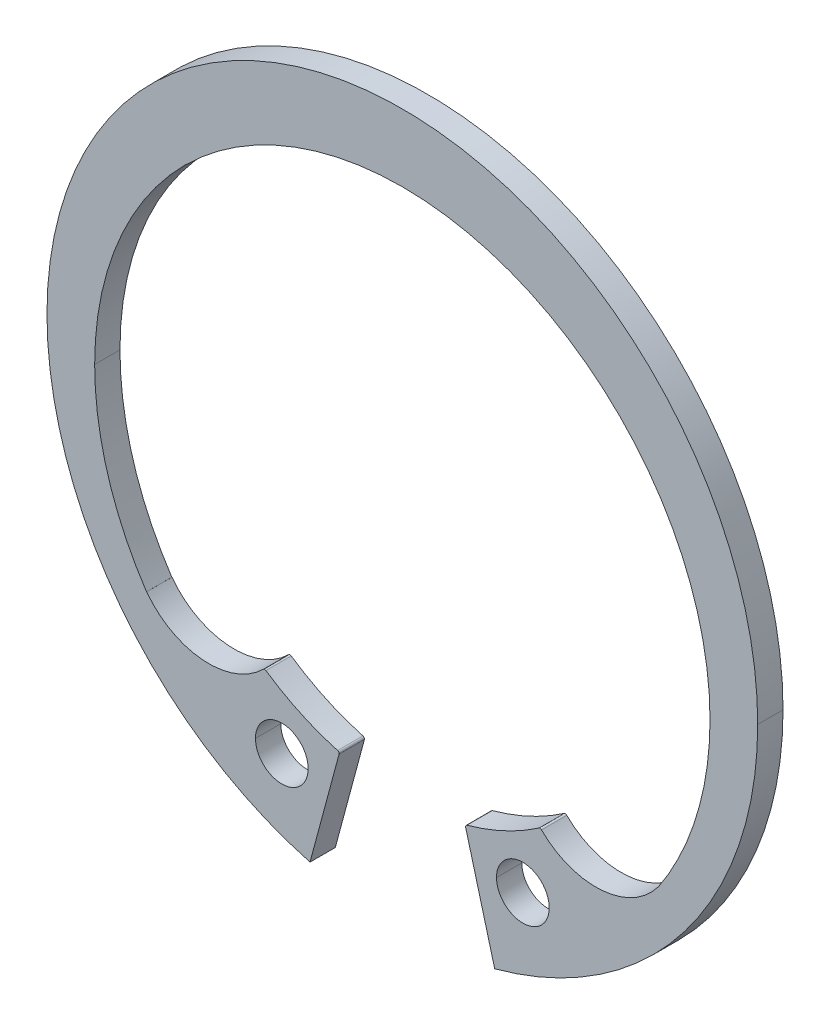
ISO-10303-21;
HEADER;
FILE_DESCRIPTION(('STEP AP214'),'2;1');
FILE_NAME('part.step','',(''),(''),'','','');
FILE_SCHEMA(('AUTOMOTIVE_DESIGN { 1 0 10303 214 1 1 1 1 }'));
ENDSEC;
DATA;
#1=APPLICATION_CONTEXT('core data for automotive mechanical design processes');
#2=APPLICATION_PROTOCOL_DEFINITION('international standard','automotive_design',2000,#1);
#3=PRODUCT_CONTEXT('',#1,'mechanical');
#4=PRODUCT('Part','Part','',(#3));
#5=PRODUCT_RELATED_PRODUCT_CATEGORY('part','',(#4));
#6=PRODUCT_DEFINITION_FORMATION('','',#4);
#7=PRODUCT_DEFINITION_CONTEXT('part definition',#1,'design');
#8=PRODUCT_DEFINITION('design','',#6,#7);
#9=PRODUCT_DEFINITION_SHAPE('','',#8);
#10=(LENGTH_UNIT() NAMED_UNIT(*) SI_UNIT(.MILLI.,.METRE.));
#11=(NAMED_UNIT(*) PLANE_ANGLE_UNIT() SI_UNIT($,.RADIAN.));
#12=(NAMED_UNIT(*) SI_UNIT($,.STERADIAN.) SOLID_ANGLE_UNIT());
#13=UNCERTAINTY_MEASURE_WITH_UNIT(LENGTH_MEASURE(1.E-05),#10,'distance_accuracy_value','');
#14=(GEOMETRIC_REPRESENTATION_CONTEXT(3) GLOBAL_UNCERTAINTY_ASSIGNED_CONTEXT((#13)) GLOBAL_UNIT_ASSIGNED_CONTEXT((#10,
#11,#12)) REPRESENTATION_CONTEXT('',''));
#15=CARTESIAN_POINT('',(0.,0.,0.));
#16=DIRECTION('',(0.,0.,1.));
#17=DIRECTION('',(1.,0.,0.));
#18=AXIS2_PLACEMENT_3D('',#15,#16,#17);
#19=CARTESIAN_POINT('',(-3.09794375698009,-11.1267805082417,-1.2));
#20=DIRECTION('',(0.,0.,1.));
#21=DIRECTION('',(1.,0.,0.));
#22=AXIS2_PLACEMENT_3D('',#19,#20,#21);
#23=CYLINDRICAL_SURFACE('',#22,0.100000000000002);
#24=DIRECTION('',(0.,0.,1.));
#25=VECTOR('',#24,1.);
#26=CARTESIAN_POINT('',(-2.99794375698009,-11.1267805082417,-1.2));
#27=LINE('',#26,#25);
#28=CARTESIAN_POINT('',(-2.99794375698009,-11.1267805082417,-1.2));
#29=VERTEX_POINT('',#28);
#30=CARTESIAN_POINT('',(-2.99794375698009,-11.1267805082417,0.));
#31=VERTEX_POINT('',#30);
#32=EDGE_CURVE('E288',#29,#31,#27,.T.);
#33=ORIENTED_EDGE('',*,*,#32,.F.);
#34=CARTESIAN_POINT('',(-3.09794375698009,-11.1267805082417,-1.2));
#35=DIRECTION('',(0.,0.,1.));
#36=DIRECTION('',(-1.,0.,0.));
#37=AXIS2_PLACEMENT_3D('',#34,#35,#36);
#38=CIRCLE('',#37,0.100000000000002);
#39=CARTESIAN_POINT('',(-3.07112173311014,-11.0304447462656,-1.2));
#40=VERTEX_POINT('',#39);
#41=EDGE_CURVE('E254',#29,#40,#38,.T.);
#42=ORIENTED_EDGE('',*,*,#41,.T.);
#43=DIRECTION('',(0.,0.,1.));
#44=VECTOR('',#43,1.);
#45=CARTESIAN_POINT('',(-3.07112173311014,-11.0304447462656,-1.2));
#46=LINE('',#45,#44);
#47=CARTESIAN_POINT('',(-3.07112173311014,-11.0304447462656,0.));
#48=VERTEX_POINT('',#47);
#49=EDGE_CURVE('E267',#40,#48,#46,.T.);
#50=ORIENTED_EDGE('',*,*,#49,.T.);
#51=CARTESIAN_POINT('',(-3.09794375698009,-11.1267805082417,0.));
#52=DIRECTION('',(0.,0.,1.));
#53=DIRECTION('',(-1.,0.,0.));
#54=AXIS2_PLACEMENT_3D('',#51,#52,#53);
#55=CIRCLE('',#54,0.100000000000002);
#56=EDGE_CURVE('E259',#31,#48,#55,.T.);
#57=ORIENTED_EDGE('',*,*,#56,.F.);
#58=EDGE_LOOP('',(#33,#42,#50,#57));
#59=FACE_BOUND('',#58,.T.);
#60=ADVANCED_FACE('F17',(#59),#23,.T.);
#61=CARTESIAN_POINT('',(-6.52530150985386,-9.53010704061077,-1.2));
#62=DIRECTION('',(0.,0.,1.));
#63=DIRECTION('',(1.,0.,0.));
#64=AXIS2_PLACEMENT_3D('',#61,#62,#63);
#65=CYLINDRICAL_SURFACE('',#64,0.100000000000005);
#66=CARTESIAN_POINT('',(-6.52530150985386,-9.53010704061077,0.));
#67=DIRECTION('',(0.,0.,1.));
#68=DIRECTION('',(1.,0.,0.));
#69=AXIS2_PLACEMENT_3D('',#66,#67,#68);
#70=CIRCLE('',#69,0.100000000000005);
#71=CARTESIAN_POINT('',(-6.46880539288542,-9.44759529134141,0.));
#72=VERTEX_POINT('',#71);
#73=CARTESIAN_POINT('',(-6.59559305403814,-9.45897969835626,0.));
#74=VERTEX_POINT('',#73);
#75=EDGE_CURVE('E342',#72,#74,#70,.T.);
#76=ORIENTED_EDGE('',*,*,#75,.F.);
#77=DIRECTION('',(0.,0.,1.));
#78=VECTOR('',#77,1.);
#79=CARTESIAN_POINT('',(-6.46880539288542,-9.44759529134141,-1.2));
#80=LINE('',#79,#78);
#81=CARTESIAN_POINT('',(-6.46880539288542,-9.44759529134141,-1.2));
#82=VERTEX_POINT('',#81);
#83=EDGE_CURVE('E318',#82,#72,#80,.T.);
#84=ORIENTED_EDGE('',*,*,#83,.F.);
#85=CARTESIAN_POINT('',(-6.52530150985386,-9.53010704061077,-1.2));
#86=DIRECTION('',(0.,0.,1.));
#87=DIRECTION('',(1.,0.,0.));
#88=AXIS2_PLACEMENT_3D('',#85,#86,#87);
#89=CIRCLE('',#88,0.100000000000005);
#90=CARTESIAN_POINT('',(-6.59559305403814,-9.45897969835626,-1.2));
#91=VERTEX_POINT('',#90);
#92=EDGE_CURVE('E366',#82,#91,#89,.T.);
#93=ORIENTED_EDGE('',*,*,#92,.T.);
#94=DIRECTION('',(0.,0.,1.));
#95=VECTOR('',#94,1.);
#96=CARTESIAN_POINT('',(-6.59559305403814,-9.45897969835626,-1.2));
#97=LINE('',#96,#95);
#98=EDGE_CURVE('E11',#91,#74,#97,.T.);
#99=ORIENTED_EDGE('',*,*,#98,.T.);
#100=EDGE_LOOP('',(#76,#84,#93,#99));
#101=FACE_BOUND('',#100,.T.);
#102=ADVANCED_FACE('F569',(#101),#65,.T.);
#103=CARTESIAN_POINT('',(-9.1782052770994,-6.84565905457062,-1.2));
#104=DIRECTION('',(0.,0.,1.));
#105=DIRECTION('',(1.,0.,0.));
#106=AXIS2_PLACEMENT_3D('',#103,#104,#105);
#107=CYLINDRICAL_SURFACE('',#106,3.67414353039474);
#108=CARTESIAN_POINT('',(-9.1782052770994,-6.84565905457062,0.));
#109=DIRECTION('',(0.,0.,-1.));
#110=DIRECTION('',(1.,0.,0.));
#111=AXIS2_PLACEMENT_3D('',#108,#109,#110);
#112=CIRCLE('',#111,3.67414353039474);
#113=CARTESIAN_POINT('',(-12.1233619181029,-9.04233450667882,0.));
#114=VERTEX_POINT('',#113);
#115=EDGE_CURVE('E331',#74,#114,#112,.T.);
#116=ORIENTED_EDGE('',*,*,#115,.F.);
#117=ORIENTED_EDGE('',*,*,#98,.F.);
#118=CARTESIAN_POINT('',(-9.1782052770994,-6.84565905457062,-1.2));
#119=DIRECTION('',(0.,0.,-1.));
#120=DIRECTION('',(1.,0.,0.));
#121=AXIS2_PLACEMENT_3D('',#118,#119,#120);
#122=CIRCLE('',#121,3.67414353039474);
#123=CARTESIAN_POINT('',(-12.1233619181029,-9.04233450667882,-1.2));
#124=VERTEX_POINT('',#123);
#125=EDGE_CURVE('E458',#91,#124,#122,.T.);
#126=ORIENTED_EDGE('',*,*,#125,.T.);
#127=DIRECTION('',(0.,0.,1.));
#128=VECTOR('',#127,1.);
#129=CARTESIAN_POINT('',(-12.1233619181029,-9.04233450667882,-1.2));
#130=LINE('',#129,#128);
#131=EDGE_CURVE('E28',#124,#114,#130,.T.);
#132=ORIENTED_EDGE('',*,*,#131,.T.);
#133=EDGE_LOOP('',(#116,#117,#126,#132));
#134=FACE_BOUND('',#133,.T.);
#135=ADVANCED_FACE('F571',(#134),#107,.F.);
#136=CARTESIAN_POINT('',(-13.506791171976,-10.0741794820537,-1.2));
#137=DIRECTION('',(-0.597874153237609,0.801589980532699,0.));
#138=DIRECTION('',(0.,0.,1.));
#139=AXIS2_PLACEMENT_3D('',#136,#137,#138);
#140=PLANE('',#139);
#141=DIRECTION('',(-0.801589980532699,-0.597874153237609,0.));
#142=VECTOR('',#141,1.);
#143=CARTESIAN_POINT('',(-13.506791171976,-10.0741794820537,-1.2));
#144=LINE('',#143,#142);
#145=CARTESIAN_POINT('',(-12.1286137504347,-9.04625163998213,-1.2));
#146=VERTEX_POINT('',#145);
#147=EDGE_CURVE('E314',#124,#146,#144,.T.);
#148=ORIENTED_EDGE('',*,*,#147,.T.);
#149=DIRECTION('',(0.,0.,1.));
#150=VECTOR('',#149,1.);
#151=CARTESIAN_POINT('',(-12.1286137504347,-9.04625163998213,-1.2));
#152=LINE('',#151,#150);
#153=CARTESIAN_POINT('',(-12.1286137504347,-9.04625163998213,0.));
#154=VERTEX_POINT('',#153);
#155=EDGE_CURVE('E279',#146,#154,#152,.T.);
#156=ORIENTED_EDGE('',*,*,#155,.T.);
#157=DIRECTION('',(-0.801589980532699,-0.597874153237609,0.));
#158=VECTOR('',#157,1.);
#159=CARTESIAN_POINT('',(-13.506791171976,-10.0741794820537,0.));
#160=LINE('',#159,#158);
#161=EDGE_CURVE('E409',#114,#154,#160,.T.);
#162=ORIENTED_EDGE('',*,*,#161,.F.);
#163=ORIENTED_EDGE('',*,*,#131,.F.);
#164=EDGE_LOOP('',(#148,#156,#162,#163));
#165=FACE_BOUND('',#164,.T.);
#166=ADVANCED_FACE('F578',(#165),#140,.T.);
#167=CARTESIAN_POINT('',(0.,0.,-1.2));
#168=DIRECTION('',(0.,0.,1.));
#169=DIRECTION('',(1.,0.,0.));
#170=AXIS2_PLACEMENT_3D('',#167,#168,#169);
#171=CYLINDRICAL_SURFACE('',#170,11.45);
#172=CARTESIAN_POINT('',(0.,0.,0.));
#173=DIRECTION('',(0.,0.,-1.));
#174=DIRECTION('',(1.,0.,0.));
#175=AXIS2_PLACEMENT_3D('',#172,#173,#174);
#176=CIRCLE('',#175,11.45);
#177=EDGE_CURVE('E262',#48,#72,#176,.T.);
#178=ORIENTED_EDGE('',*,*,#177,.F.);
#179=ORIENTED_EDGE('',*,*,#49,.F.);
#180=CARTESIAN_POINT('',(0.,0.,-1.2));
#181=DIRECTION('',(0.,0.,-1.));
#182=DIRECTION('',(1.,0.,0.));
#183=AXIS2_PLACEMENT_3D('',#180,#181,#182);
#184=CIRCLE('',#183,11.45);
#185=EDGE_CURVE('E361',#40,#82,#184,.T.);
#186=ORIENTED_EDGE('',*,*,#185,.T.);
#187=ORIENTED_EDGE('',*,*,#83,.T.);
#188=EDGE_LOOP('',(#178,#179,#186,#187));
#189=FACE_BOUND('',#188,.T.);
#190=ADVANCED_FACE('F477',(#189),#171,.F.);
#191=CARTESIAN_POINT('',(12.1233619181029,-9.04233450667882,-1.2));
#192=DIRECTION('',(0.597874153237609,0.801589980532699,0.));
#193=DIRECTION('',(0.,0.,-1.));
#194=AXIS2_PLACEMENT_3D('',#191,#192,#193);
#195=PLANE('',#194);
#196=DIRECTION('',(-0.801589980532699,0.597874153237609,0.));
#197=VECTOR('',#196,1.);
#198=CARTESIAN_POINT('',(12.1233619181029,-9.04233450667882,0.));
#199=LINE('',#198,#197);
#200=CARTESIAN_POINT('',(12.1286137504347,-9.04625163998213,0.));
#201=VERTEX_POINT('',#200);
#202=CARTESIAN_POINT('',(12.1233619181029,-9.04233450667882,0.));
#203=VERTEX_POINT('',#202);
#204=EDGE_CURVE('E414',#201,#203,#199,.T.);
#205=ORIENTED_EDGE('',*,*,#204,.F.);
#206=DIRECTION('',(0.,0.,-1.));
#207=VECTOR('',#206,1.);
#208=CARTESIAN_POINT('',(12.1286137504347,-9.04625163998213,-1.2));
#209=LINE('',#208,#207);
#210=CARTESIAN_POINT('',(12.1286137504347,-9.04625163998213,-1.2));
#211=VERTEX_POINT('',#210);
#212=EDGE_CURVE('E272',#201,#211,#209,.T.);
#213=ORIENTED_EDGE('',*,*,#212,.T.);
#214=DIRECTION('',(-0.801589980532699,0.597874153237609,0.));
#215=VECTOR('',#214,1.);
#216=CARTESIAN_POINT('',(12.1233619181029,-9.04233450667882,-1.2));
#217=LINE('',#216,#215);
#218=CARTESIAN_POINT('',(12.1233619181029,-9.04233450667882,-1.2));
#219=VERTEX_POINT('',#218);
#220=EDGE_CURVE('E358',#211,#219,#217,.T.);
#221=ORIENTED_EDGE('',*,*,#220,.T.);
#222=DIRECTION('',(0.,0.,1.));
#223=VECTOR('',#222,1.);
#224=CARTESIAN_POINT('',(12.1233619181029,-9.04233450667882,-1.2));
#225=LINE('',#224,#223);
#226=EDGE_CURVE('E264',#219,#203,#225,.T.);
#227=ORIENTED_EDGE('',*,*,#226,.T.);
#228=EDGE_LOOP('',(#205,#213,#221,#227));
#229=FACE_BOUND('',#228,.T.);
#230=ADVANCED_FACE('F602',(#229),#195,.T.);
#231=CARTESIAN_POINT('',(9.1782052770994,-6.84565905457062,-1.2));
#232=DIRECTION('',(0.,0.,1.));
#233=DIRECTION('',(1.,0.,0.));
#234=AXIS2_PLACEMENT_3D('',#231,#232,#233);
#235=CYLINDRICAL_SURFACE('',#234,3.67414353039474);
#236=CARTESIAN_POINT('',(9.1782052770994,-6.84565905457062,0.));
#237=DIRECTION('',(0.,0.,-1.));
#238=DIRECTION('',(1.,0.,0.));
#239=AXIS2_PLACEMENT_3D('',#236,#237,#238);
#240=CIRCLE('',#239,3.67414353039474);
#241=CARTESIAN_POINT('',(6.59559305403814,-9.45897969835626,0.));
#242=VERTEX_POINT('',#241);
#243=EDGE_CURVE('E258',#203,#242,#240,.T.);
#244=ORIENTED_EDGE('',*,*,#243,.F.);
#245=ORIENTED_EDGE('',*,*,#226,.F.);
#246=CARTESIAN_POINT('',(9.1782052770994,-6.84565905457062,-1.2));
#247=DIRECTION('',(0.,0.,-1.));
#248=DIRECTION('',(1.,0.,0.));
#249=AXIS2_PLACEMENT_3D('',#246,#247,#248);
#250=CIRCLE('',#249,3.67414353039474);
#251=CARTESIAN_POINT('',(6.59559305403814,-9.45897969835626,-1.2));
#252=VERTEX_POINT('',#251);
#253=EDGE_CURVE('E240',#219,#252,#250,.T.);
#254=ORIENTED_EDGE('',*,*,#253,.T.);
#255=DIRECTION('',(0.,0.,1.));
#256=VECTOR('',#255,1.);
#257=CARTESIAN_POINT('',(6.59559305403814,-9.45897969835626,-1.2));
#258=LINE('',#257,#256);
#259=EDGE_CURVE('E235',#252,#242,#258,.T.);
#260=ORIENTED_EDGE('',*,*,#259,.T.);
#261=EDGE_LOOP('',(#244,#245,#254,#260));
#262=FACE_BOUND('',#261,.T.);
#263=ADVANCED_FACE('F607',(#262),#235,.F.);
#264=CARTESIAN_POINT('',(6.52530150985386,-9.53010704061077,-1.2));
#265=DIRECTION('',(0.,0.,1.));
#266=DIRECTION('',(1.,0.,0.));
#267=AXIS2_PLACEMENT_3D('',#264,#265,#266);
#268=CYLINDRICAL_SURFACE('',#267,0.100000000000005);
#269=CARTESIAN_POINT('',(6.52530150985386,-9.53010704061077,0.));
#270=DIRECTION('',(0.,0.,1.));
#271=DIRECTION('',(-1.,0.,0.));
#272=AXIS2_PLACEMENT_3D('',#269,#270,#271);
#273=CIRCLE('',#272,0.100000000000005);
#274=CARTESIAN_POINT('',(6.46880539288542,-9.44759529134142,0.));
#275=VERTEX_POINT('',#274);
#276=EDGE_CURVE('E324',#242,#275,#273,.T.);
#277=ORIENTED_EDGE('',*,*,#276,.F.);
#278=ORIENTED_EDGE('',*,*,#259,.F.);
#279=CARTESIAN_POINT('',(6.52530150985386,-9.53010704061077,-1.2));
#280=DIRECTION('',(0.,0.,1.));
#281=DIRECTION('',(-1.,0.,0.));
#282=AXIS2_PLACEMENT_3D('',#279,#280,#281);
#283=CIRCLE('',#282,0.100000000000005);
#284=CARTESIAN_POINT('',(6.46880539288542,-9.44759529134142,-1.2));
#285=VERTEX_POINT('',#284);
#286=EDGE_CURVE('E233',#252,#285,#283,.T.);
#287=ORIENTED_EDGE('',*,*,#286,.T.);
#288=DIRECTION('',(0.,0.,1.));
#289=VECTOR('',#288,1.);
#290=CARTESIAN_POINT('',(6.46880539288542,-9.44759529134142,-1.2));
#291=LINE('',#290,#289);
#292=EDGE_CURVE('E217',#285,#275,#291,.T.);
#293=ORIENTED_EDGE('',*,*,#292,.T.);
#294=EDGE_LOOP('',(#277,#278,#287,#293));
#295=FACE_BOUND('',#294,.T.);
#296=ADVANCED_FACE('F234',(#295),#268,.T.);
#297=CARTESIAN_POINT('',(3.09794375698009,-11.1267805082417,-1.2));
#298=DIRECTION('',(0.,0.,1.));
#299=DIRECTION('',(1.,0.,0.));
#300=AXIS2_PLACEMENT_3D('',#297,#298,#299);
#301=CYLINDRICAL_SURFACE('',#300,0.0999999999999981);
#302=CARTESIAN_POINT('',(3.09794375698009,-11.1267805082417,0.));
#303=DIRECTION('',(0.,0.,1.));
#304=DIRECTION('',(1.,0.,0.));
#305=AXIS2_PLACEMENT_3D('',#302,#303,#304);
#306=CIRCLE('',#305,0.0999999999999981);
#307=CARTESIAN_POINT('',(3.07112173311014,-11.0304447462656,0.));
#308=VERTEX_POINT('',#307);
#309=CARTESIAN_POINT('',(3.00137938047477,-11.1527674509272,0.));
#310=VERTEX_POINT('',#309);
#311=EDGE_CURVE('E263',#308,#310,#306,.T.);
#312=ORIENTED_EDGE('',*,*,#311,.F.);
#313=DIRECTION('',(0.,0.,1.));
#314=VECTOR('',#313,1.);
#315=CARTESIAN_POINT('',(3.07112173311014,-11.0304447462656,-1.2));
#316=LINE('',#315,#314);
#317=CARTESIAN_POINT('',(3.07112173311014,-11.0304447462656,-1.2));
#318=VERTEX_POINT('',#317);
#319=EDGE_CURVE('E229',#318,#308,#316,.T.);
#320=ORIENTED_EDGE('',*,*,#319,.F.);
#321=CARTESIAN_POINT('',(3.09794375698009,-11.1267805082417,-1.2));
#322=DIRECTION('',(0.,0.,1.));
#323=DIRECTION('',(1.,0.,0.));
#324=AXIS2_PLACEMENT_3D('',#321,#322,#323);
#325=CIRCLE('',#324,0.0999999999999981);
#326=CARTESIAN_POINT('',(3.00137938047477,-11.1527674509272,-1.2));
#327=VERTEX_POINT('',#326);
#328=EDGE_CURVE('E246',#318,#327,#325,.T.);
#329=ORIENTED_EDGE('',*,*,#328,.T.);
#330=DIRECTION('',(0.,0.,1.));
#331=VECTOR('',#330,1.);
#332=CARTESIAN_POINT('',(3.00137938047477,-11.1527674509272,-1.2));
#333=LINE('',#332,#331);
#334=EDGE_CURVE('E283',#327,#310,#333,.T.);
#335=ORIENTED_EDGE('',*,*,#334,.T.);
#336=EDGE_LOOP('',(#312,#320,#329,#335));
#337=FACE_BOUND('',#336,.T.);
#338=ADVANCED_FACE('F621',(#337),#301,.T.);
#339=CARTESIAN_POINT('',(0.,0.,-1.2));
#340=DIRECTION('',(0.,0.,1.));
#341=DIRECTION('',(1.,0.,0.));
#342=AXIS2_PLACEMENT_3D('',#339,#340,#341);
#343=CYLINDRICAL_SURFACE('',#342,11.45);
#344=CARTESIAN_POINT('',(0.,0.,0.));
#345=DIRECTION('',(0.,0.,-1.));
#346=DIRECTION('',(1.,0.,0.));
#347=AXIS2_PLACEMENT_3D('',#344,#345,#346);
#348=CIRCLE('',#347,11.45);
#349=EDGE_CURVE('E224',#275,#308,#348,.T.);
#350=ORIENTED_EDGE('',*,*,#349,.F.);
#351=ORIENTED_EDGE('',*,*,#292,.F.);
#352=CARTESIAN_POINT('',(0.,0.,-1.2));
#353=DIRECTION('',(0.,0.,-1.));
#354=DIRECTION('',(1.,0.,0.));
#355=AXIS2_PLACEMENT_3D('',#352,#353,#354);
#356=CIRCLE('',#355,11.45);
#357=EDGE_CURVE('E221',#285,#318,#356,.T.);
#358=ORIENTED_EDGE('',*,*,#357,.T.);
#359=ORIENTED_EDGE('',*,*,#319,.T.);
#360=EDGE_LOOP('',(#350,#351,#358,#359));
#361=FACE_BOUND('',#360,.T.);
#362=ADVANCED_FACE('F219',(#361),#343,.F.);
#363=CARTESIAN_POINT('',(-5.71420849742751,-12.4789200753882,-1.2));
#364=DIRECTION('',(0.,0.,1.));
#365=DIRECTION('',(1.,0.,0.));
#366=AXIS2_PLACEMENT_3D('',#363,#364,#365);
#367=CYLINDRICAL_SURFACE('',#366,1.25);
#368=DIRECTION('',(0.,0.,1.));
#369=VECTOR('',#368,1.);
#370=CARTESIAN_POINT('',(-6.96420849742751,-12.4789200753882,-1.2));
#371=LINE('',#370,#369);
#372=CARTESIAN_POINT('',(-6.96420849742751,-12.4789200753882,-1.2));
#373=VERTEX_POINT('',#372);
#374=CARTESIAN_POINT('',(-6.96420849742751,-12.4789200753882,0.));
#375=VERTEX_POINT('',#374);
#376=EDGE_CURVE('E391',#373,#375,#371,.T.);
#377=ORIENTED_EDGE('',*,*,#376,.F.);
#378=CARTESIAN_POINT('',(-5.71420849742751,-12.4789200753882,-1.2));
#379=DIRECTION('',(0.,0.,1.));
#380=DIRECTION('',(1.,0.,0.));
#381=AXIS2_PLACEMENT_3D('',#378,#379,#380);
#382=CIRCLE('',#381,1.25);
#383=CARTESIAN_POINT('',(-4.4642084974275,-12.4789200753882,-1.2));
#384=VERTEX_POINT('',#383);
#385=EDGE_CURVE('E77',#384,#373,#382,.T.);
#386=ORIENTED_EDGE('',*,*,#385,.F.);
#387=DIRECTION('',(0.,0.,1.));
#388=VECTOR('',#387,1.);
#389=CARTESIAN_POINT('',(-4.4642084974275,-12.4789200753882,-1.2));
#390=LINE('',#389,#388);
#391=CARTESIAN_POINT('',(-4.4642084974275,-12.4789200753882,0.));
#392=VERTEX_POINT('',#391);
#393=EDGE_CURVE('E382',#384,#392,#390,.T.);
#394=ORIENTED_EDGE('',*,*,#393,.T.);
#395=CARTESIAN_POINT('',(-5.71420849742751,-12.4789200753882,0.));
#396=DIRECTION('',(0.,0.,1.));
#397=DIRECTION('',(1.,0.,0.));
#398=AXIS2_PLACEMENT_3D('',#395,#396,#397);
#399=CIRCLE('',#398,1.25);
#400=EDGE_CURVE('E230',#392,#375,#399,.T.);
#401=ORIENTED_EDGE('',*,*,#400,.T.);
#402=EDGE_LOOP('',(#377,#386,#394,#401));
#403=FACE_BOUND('',#402,.T.);
#404=ADVANCED_FACE('F626',(#403),#367,.F.);
#405=CARTESIAN_POINT('',(5.71420849742751,-12.4789200753882,-1.2));
#406=DIRECTION('',(0.,0.,1.));
#407=DIRECTION('',(1.,0.,0.));
#408=AXIS2_PLACEMENT_3D('',#405,#406,#407);
#409=CYLINDRICAL_SURFACE('',#408,1.25);
#410=DIRECTION('',(0.,0.,1.));
#411=VECTOR('',#410,1.);
#412=CARTESIAN_POINT('',(4.4642084974275,-12.4789200753882,-1.2));
#413=LINE('',#412,#411);
#414=CARTESIAN_POINT('',(4.4642084974275,-12.4789200753882,-1.2));
#415=VERTEX_POINT('',#414);
#416=CARTESIAN_POINT('',(4.4642084974275,-12.4789200753882,0.));
#417=VERTEX_POINT('',#416);
#418=EDGE_CURVE('E370',#415,#417,#413,.T.);
#419=ORIENTED_EDGE('',*,*,#418,.F.);
#420=CARTESIAN_POINT('',(5.71420849742751,-12.4789200753882,-1.2));
#421=DIRECTION('',(0.,0.,1.));
#422=DIRECTION('',(1.,0.,0.));
#423=AXIS2_PLACEMENT_3D('',#420,#421,#422);
#424=CIRCLE('',#423,1.25);
#425=CARTESIAN_POINT('',(6.96420849742751,-12.4789200753882,-1.2));
#426=VERTEX_POINT('',#425);
#427=EDGE_CURVE('E410',#426,#415,#424,.T.);
#428=ORIENTED_EDGE('',*,*,#427,.F.);
#429=DIRECTION('',(0.,0.,1.));
#430=VECTOR('',#429,1.);
#431=CARTESIAN_POINT('',(6.96420849742751,-12.4789200753882,-1.2));
#432=LINE('',#431,#430);
#433=CARTESIAN_POINT('',(6.96420849742751,-12.4789200753882,0.));
#434=VERTEX_POINT('',#433);
#435=EDGE_CURVE('E292',#426,#434,#432,.T.);
#436=ORIENTED_EDGE('',*,*,#435,.T.);
#437=CARTESIAN_POINT('',(5.71420849742751,-12.4789200753882,0.));
#438=DIRECTION('',(0.,0.,1.));
#439=DIRECTION('',(1.,0.,0.));
#440=AXIS2_PLACEMENT_3D('',#437,#438,#439);
#441=CIRCLE('',#440,1.25);
#442=EDGE_CURVE('E328',#434,#417,#441,.T.);
#443=ORIENTED_EDGE('',*,*,#442,.T.);
#444=EDGE_LOOP('',(#419,#428,#436,#443));
#445=FACE_BOUND('',#444,.T.);
#446=ADVANCED_FACE('F19',(#445),#409,.F.);
#447=CARTESIAN_POINT('',(0.,0.,0.));
#448=DIRECTION('',(0.,0.,1.));
#449=DIRECTION('',(1.,0.,0.));
#450=AXIS2_PLACEMENT_3D('',#447,#448,#449);
#451=PLANE('',#450);
#452=ORIENTED_EDGE('',*,*,#400,.F.);
#453=CARTESIAN_POINT('',(-5.71420849742751,-12.4789200753882,0.));
#454=DIRECTION('',(0.,0.,1.));
#455=DIRECTION('',(1.,0.,0.));
#456=AXIS2_PLACEMENT_3D('',#453,#454,#455);
#457=CIRCLE('',#456,1.25);
#458=EDGE_CURVE('E386',#375,#392,#457,.T.);
#459=ORIENTED_EDGE('',*,*,#458,.F.);
#460=EDGE_LOOP('',(#452,#459));
#461=FACE_BOUND('',#460,.T.);
#462=ORIENTED_EDGE('',*,*,#442,.F.);
#463=CARTESIAN_POINT('',(5.71420849742751,-12.4789200753882,0.));
#464=DIRECTION('',(0.,0.,1.));
#465=DIRECTION('',(1.,0.,0.));
#466=AXIS2_PLACEMENT_3D('',#463,#464,#465);
#467=CIRCLE('',#466,1.25);
#468=EDGE_CURVE('E297',#417,#434,#467,.T.);
#469=ORIENTED_EDGE('',*,*,#468,.F.);
#470=EDGE_LOOP('',(#462,#469));
#471=FACE_BOUND('',#470,.T.);
#472=ORIENTED_EDGE('',*,*,#161,.T.);
#473=CARTESIAN_POINT('',(0.,-0.938821108372825,0.));
#474=DIRECTION('',(0.,0.,-1.));
#475=DIRECTION('',(1.,0.,0.));
#476=AXIS2_PLACEMENT_3D('',#473,#474,#475);
#477=CIRCLE('',#476,14.5888211083728);
#478=CARTESIAN_POINT('',(-14.5888211083728,-0.938821108372823,0.));
#479=VERTEX_POINT('',#478);
#480=EDGE_CURVE('E437',#154,#479,#477,.T.);
#481=ORIENTED_EDGE('',*,*,#480,.T.);
#482=CARTESIAN_POINT('',(0.,-0.938821108372825,0.));
#483=DIRECTION('',(0.,0.,-1.));
#484=DIRECTION('',(1.,0.,0.));
#485=AXIS2_PLACEMENT_3D('',#482,#483,#484);
#486=CIRCLE('',#485,14.5888211083728);
#487=CARTESIAN_POINT('',(14.5888211083728,-0.938821108372825,0.));
#488=VERTEX_POINT('',#487);
#489=EDGE_CURVE('E21',#479,#488,#486,.T.);
#490=ORIENTED_EDGE('',*,*,#489,.T.);
#491=CARTESIAN_POINT('',(0.,-0.938821108372825,0.));
#492=DIRECTION('',(0.,0.,-1.));
#493=DIRECTION('',(1.,0.,0.));
#494=AXIS2_PLACEMENT_3D('',#491,#492,#493);
#495=CIRCLE('',#494,14.5888211083728);
#496=EDGE_CURVE('E321',#488,#201,#495,.T.);
#497=ORIENTED_EDGE('',*,*,#496,.T.);
#498=ORIENTED_EDGE('',*,*,#204,.T.);
#499=ORIENTED_EDGE('',*,*,#243,.T.);
#500=ORIENTED_EDGE('',*,*,#276,.T.);
#501=ORIENTED_EDGE('',*,*,#349,.T.);
#502=ORIENTED_EDGE('',*,*,#311,.T.);
#503=DIRECTION('',(0.259869426854587,-0.965643765053277,0.));
#504=VECTOR('',#503,1.);
#505=CARTESIAN_POINT('',(4.37879984249977,-16.2710974411477,0.));
#506=LINE('',#505,#504);
#507=CARTESIAN_POINT('',(4.37879984249977,-16.2710974411477,0.));
#508=VERTEX_POINT('',#507);
#509=EDGE_CURVE('E327',#310,#508,#506,.T.);
#510=ORIENTED_EDGE('',*,*,#509,.T.);
#511=CARTESIAN_POINT('',(0.,0.,0.));
#512=DIRECTION('',(0.,0.,1.));
#513=DIRECTION('',(1.,0.,0.));
#514=AXIS2_PLACEMENT_3D('',#511,#512,#513);
#515=CIRCLE('',#514,16.85);
#516=CARTESIAN_POINT('',(16.85,0.,0.));
#517=VERTEX_POINT('',#516);
#518=EDGE_CURVE('E309',#508,#517,#515,.T.);
#519=ORIENTED_EDGE('',*,*,#518,.T.);
#520=CARTESIAN_POINT('',(0.,0.,0.));
#521=DIRECTION('',(0.,0.,1.));
#522=DIRECTION('',(1.,0.,0.));
#523=AXIS2_PLACEMENT_3D('',#520,#521,#522);
#524=CIRCLE('',#523,16.85);
#525=CARTESIAN_POINT('',(-16.85,0.,0.));
#526=VERTEX_POINT('',#525);
#527=EDGE_CURVE('E381',#517,#526,#524,.T.);
#528=ORIENTED_EDGE('',*,*,#527,.T.);
#529=CARTESIAN_POINT('',(0.,0.,0.));
#530=DIRECTION('',(0.,0.,1.));
#531=DIRECTION('',(1.,0.,0.));
#532=AXIS2_PLACEMENT_3D('',#529,#530,#531);
#533=CIRCLE('',#532,16.85);
#534=CARTESIAN_POINT('',(-4.37879984249977,-16.2710974411477,0.));
#535=VERTEX_POINT('',#534);
#536=EDGE_CURVE('E302',#526,#535,#533,.T.);
#537=ORIENTED_EDGE('',*,*,#536,.T.);
#538=DIRECTION('',(0.259869426854587,0.965643765053277,0.));
#539=VECTOR('',#538,1.);
#540=CARTESIAN_POINT('',(-4.37879984249977,-16.2710974411477,0.));
#541=LINE('',#540,#539);
#542=CARTESIAN_POINT('',(-3.00137938047477,-11.1527674509272,0.));
#543=VERTEX_POINT('',#542);
#544=EDGE_CURVE('E315',#535,#543,#541,.T.);
#545=ORIENTED_EDGE('',*,*,#544,.T.);
#546=CARTESIAN_POINT('',(-3.09794375698009,-11.1267805082417,0.));
#547=DIRECTION('',(0.,0.,1.));
#548=DIRECTION('',(-1.,0.,0.));
#549=AXIS2_PLACEMENT_3D('',#546,#547,#548);
#550=CIRCLE('',#549,0.100000000000002);
#551=EDGE_CURVE('E390',#543,#31,#550,.T.);
#552=ORIENTED_EDGE('',*,*,#551,.T.);
#553=ORIENTED_EDGE('',*,*,#56,.T.);
#554=ORIENTED_EDGE('',*,*,#177,.T.);
#555=ORIENTED_EDGE('',*,*,#75,.T.);
#556=ORIENTED_EDGE('',*,*,#115,.T.);
#557=EDGE_LOOP('',(#472,#481,#490,#497,#498,#499,#500,#501,#502,#510,#519,#528,#537,#545,#552,
#553,#554,#555,#556));
#558=FACE_BOUND('',#557,.T.);
#559=ADVANCED_FACE('F466',(#461,#471,#558),#451,.T.);
#560=CARTESIAN_POINT('',(0.,0.,-1.2));
#561=DIRECTION('',(0.,0.,1.));
#562=DIRECTION('',(1.,0.,0.));
#563=AXIS2_PLACEMENT_3D('',#560,#561,#562);
#564=PLANE('',#563);
#565=ORIENTED_EDGE('',*,*,#385,.T.);
#566=CARTESIAN_POINT('',(-5.71420849742751,-12.4789200753882,-1.2));
#567=DIRECTION('',(0.,0.,1.));
#568=DIRECTION('',(1.,0.,0.));
#569=AXIS2_PLACEMENT_3D('',#566,#567,#568);
#570=CIRCLE('',#569,1.25);
#571=EDGE_CURVE('E395',#373,#384,#570,.T.);
#572=ORIENTED_EDGE('',*,*,#571,.T.);
#573=EDGE_LOOP('',(#565,#572));
#574=FACE_BOUND('',#573,.T.);
#575=ORIENTED_EDGE('',*,*,#427,.T.);
#576=CARTESIAN_POINT('',(5.71420849742751,-12.4789200753882,-1.2));
#577=DIRECTION('',(0.,0.,1.));
#578=DIRECTION('',(1.,0.,0.));
#579=AXIS2_PLACEMENT_3D('',#576,#577,#578);
#580=CIRCLE('',#579,1.25);
#581=EDGE_CURVE('E385',#415,#426,#580,.T.);
#582=ORIENTED_EDGE('',*,*,#581,.T.);
#583=EDGE_LOOP('',(#575,#582));
#584=FACE_BOUND('',#583,.T.);
#585=CARTESIAN_POINT('',(0.,-0.938821108372825,-1.2));
#586=DIRECTION('',(0.,0.,-1.));
#587=DIRECTION('',(1.,0.,0.));
#588=AXIS2_PLACEMENT_3D('',#585,#586,#587);
#589=CIRCLE('',#588,14.5888211083728);
#590=CARTESIAN_POINT('',(-14.5888211083728,-0.938821108372823,-1.2));
#591=VERTEX_POINT('',#590);
#592=EDGE_CURVE('E296',#146,#591,#589,.T.);
#593=ORIENTED_EDGE('',*,*,#592,.F.);
#594=ORIENTED_EDGE('',*,*,#147,.F.);
#595=ORIENTED_EDGE('',*,*,#125,.F.);
#596=ORIENTED_EDGE('',*,*,#92,.F.);
#597=ORIENTED_EDGE('',*,*,#185,.F.);
#598=ORIENTED_EDGE('',*,*,#41,.F.);
#599=CARTESIAN_POINT('',(-3.09794375698009,-11.1267805082417,-1.2));
#600=DIRECTION('',(0.,0.,1.));
#601=DIRECTION('',(-1.,0.,0.));
#602=AXIS2_PLACEMENT_3D('',#599,#600,#601);
#603=CIRCLE('',#602,0.100000000000002);
#604=CARTESIAN_POINT('',(-3.00137938047477,-11.1527674509272,-1.2));
#605=VERTEX_POINT('',#604);
#606=EDGE_CURVE('E284',#605,#29,#603,.T.);
#607=ORIENTED_EDGE('',*,*,#606,.F.);
#608=DIRECTION('',(0.259869426854587,0.965643765053277,0.));
#609=VECTOR('',#608,1.);
#610=CARTESIAN_POINT('',(-4.37879984249977,-16.2710974411477,-1.2));
#611=LINE('',#610,#609);
#612=CARTESIAN_POINT('',(-4.37879984249977,-16.2710974411477,-1.2));
#613=VERTEX_POINT('',#612);
#614=EDGE_CURVE('E311',#613,#605,#611,.T.);
#615=ORIENTED_EDGE('',*,*,#614,.F.);
#616=CARTESIAN_POINT('',(0.,0.,-1.2));
#617=DIRECTION('',(0.,0.,1.));
#618=DIRECTION('',(1.,0.,0.));
#619=AXIS2_PLACEMENT_3D('',#616,#617,#618);
#620=CIRCLE('',#619,16.85);
#621=CARTESIAN_POINT('',(-16.85,0.,-1.2));
#622=VERTEX_POINT('',#621);
#623=EDGE_CURVE('E303',#622,#613,#620,.T.);
#624=ORIENTED_EDGE('',*,*,#623,.F.);
#625=CARTESIAN_POINT('',(0.,0.,-1.2));
#626=DIRECTION('',(0.,0.,1.));
#627=DIRECTION('',(1.,0.,0.));
#628=AXIS2_PLACEMENT_3D('',#625,#626,#627);
#629=CIRCLE('',#628,16.85);
#630=CARTESIAN_POINT('',(16.85,0.,-1.2));
#631=VERTEX_POINT('',#630);
#632=EDGE_CURVE('E355',#631,#622,#629,.T.);
#633=ORIENTED_EDGE('',*,*,#632,.F.);
#634=CARTESIAN_POINT('',(0.,0.,-1.2));
#635=DIRECTION('',(0.,0.,1.));
#636=DIRECTION('',(1.,0.,0.));
#637=AXIS2_PLACEMENT_3D('',#634,#635,#636);
#638=CIRCLE('',#637,16.85);
#639=CARTESIAN_POINT('',(4.37879984249977,-16.2710974411477,-1.2));
#640=VERTEX_POINT('',#639);
#641=EDGE_CURVE('E380',#640,#631,#638,.T.);
#642=ORIENTED_EDGE('',*,*,#641,.F.);
#643=DIRECTION('',(0.259869426854587,-0.965643765053277,0.));
#644=VECTOR('',#643,1.);
#645=CARTESIAN_POINT('',(4.37879984249977,-16.2710974411477,-1.2));
#646=LINE('',#645,#644);
#647=EDGE_CURVE('E273',#327,#640,#646,.T.);
#648=ORIENTED_EDGE('',*,*,#647,.F.);
#649=ORIENTED_EDGE('',*,*,#328,.F.);
#650=ORIENTED_EDGE('',*,*,#357,.F.);
#651=ORIENTED_EDGE('',*,*,#286,.F.);
#652=ORIENTED_EDGE('',*,*,#253,.F.);
#653=ORIENTED_EDGE('',*,*,#220,.F.);
#654=CARTESIAN_POINT('',(0.,-0.938821108372825,-1.2));
#655=DIRECTION('',(0.,0.,-1.));
#656=DIRECTION('',(1.,0.,0.));
#657=AXIS2_PLACEMENT_3D('',#654,#655,#656);
#658=CIRCLE('',#657,14.5888211083728);
#659=CARTESIAN_POINT('',(14.5888211083728,-0.938821108372825,-1.2));
#660=VERTEX_POINT('',#659);
#661=EDGE_CURVE('E268',#660,#211,#658,.T.);
#662=ORIENTED_EDGE('',*,*,#661,.F.);
#663=CARTESIAN_POINT('',(0.,-0.938821108372825,-1.2));
#664=DIRECTION('',(0.,0.,-1.));
#665=DIRECTION('',(1.,0.,0.));
#666=AXIS2_PLACEMENT_3D('',#663,#664,#665);
#667=CIRCLE('',#666,14.5888211083728);
#668=EDGE_CURVE('E274',#591,#660,#667,.T.);
#669=ORIENTED_EDGE('',*,*,#668,.F.);
#670=EDGE_LOOP('',(#593,#594,#595,#596,#597,#598,#607,#615,#624,#633,#642,#648,#649,#650,#651,
#652,#653,#662,#669));
#671=FACE_BOUND('',#670,.T.);
#672=ADVANCED_FACE('F243',(#574,#584,#671),#564,.F.);
#673=CARTESIAN_POINT('',(-4.37879984249977,-16.2710974411477,-1.2));
#674=DIRECTION('',(0.965643765053277,-0.259869426854587,0.));
#675=DIRECTION('',(0.,0.,-1.));
#676=AXIS2_PLACEMENT_3D('',#673,#674,#675);
#677=PLANE('',#676);
#678=ORIENTED_EDGE('',*,*,#544,.F.);
#679=DIRECTION('',(0.,0.,1.));
#680=VECTOR('',#679,1.);
#681=CARTESIAN_POINT('',(-4.37879984249977,-16.2710974411477,-1.2));
#682=LINE('',#681,#680);
#683=EDGE_CURVE('E298',#613,#535,#682,.T.);
#684=ORIENTED_EDGE('',*,*,#683,.F.);
#685=ORIENTED_EDGE('',*,*,#614,.T.);
#686=DIRECTION('',(0.,0.,1.));
#687=VECTOR('',#686,1.);
#688=CARTESIAN_POINT('',(-3.00137938047477,-11.1527674509272,-1.2));
#689=LINE('',#688,#687);
#690=EDGE_CURVE('E445',#605,#543,#689,.T.);
#691=ORIENTED_EDGE('',*,*,#690,.T.);
#692=EDGE_LOOP('',(#678,#684,#685,#691));
#693=FACE_BOUND('',#692,.T.);
#694=ADVANCED_FACE('F565',(#693),#677,.T.);
#695=CARTESIAN_POINT('',(0.,-0.938821108372825,-1.2));
#696=DIRECTION('',(0.,0.,1.));
#697=DIRECTION('',(1.,0.,0.));
#698=AXIS2_PLACEMENT_3D('',#695,#696,#697);
#699=CYLINDRICAL_SURFACE('',#698,14.5888211083728);
#700=DIRECTION('',(0.,0.,1.));
#701=VECTOR('',#700,1.);
#702=CARTESIAN_POINT('',(14.5888211083728,-0.938821108372825,-1.2));
#703=LINE('',#702,#701);
#704=EDGE_CURVE('E278',#660,#488,#703,.T.);
#705=ORIENTED_EDGE('',*,*,#704,.F.);
#706=ORIENTED_EDGE('',*,*,#661,.T.);
#707=ORIENTED_EDGE('',*,*,#212,.F.);
#708=ORIENTED_EDGE('',*,*,#496,.F.);
#709=EDGE_LOOP('',(#705,#706,#707,#708));
#710=FACE_BOUND('',#709,.T.);
#711=ADVANCED_FACE('F584',(#710),#699,.F.);
#712=CARTESIAN_POINT('',(4.37879984249977,-16.2710974411477,-1.2));
#713=DIRECTION('',(-0.965643765053277,-0.259869426854587,0.));
#714=DIRECTION('',(-0.259869426854587,0.965643765053277,0.));
#715=AXIS2_PLACEMENT_3D('',#712,#713,#714);
#716=PLANE('',#715);
#717=ORIENTED_EDGE('',*,*,#509,.F.);
#718=ORIENTED_EDGE('',*,*,#334,.F.);
#719=ORIENTED_EDGE('',*,*,#647,.T.);
#720=DIRECTION('',(0.,0.,1.));
#721=VECTOR('',#720,1.);
#722=CARTESIAN_POINT('',(4.37879984249977,-16.2710974411477,-1.2));
#723=LINE('',#722,#721);
#724=EDGE_CURVE('E306',#640,#508,#723,.T.);
#725=ORIENTED_EDGE('',*,*,#724,.T.);
#726=EDGE_LOOP('',(#717,#718,#719,#725));
#727=FACE_BOUND('',#726,.T.);
#728=ADVANCED_FACE('F616',(#727),#716,.T.);
#729=CARTESIAN_POINT('',(0.,0.,-1.2));
#730=DIRECTION('',(0.,0.,1.));
#731=DIRECTION('',(1.,0.,0.));
#732=AXIS2_PLACEMENT_3D('',#729,#730,#731);
#733=CYLINDRICAL_SURFACE('',#732,16.85);
#734=DIRECTION('',(0.,0.,1.));
#735=VECTOR('',#734,1.);
#736=CARTESIAN_POINT('',(-16.85,0.,-1.2));
#737=LINE('',#736,#735);
#738=EDGE_CURVE('E513',#622,#526,#737,.T.);
#739=ORIENTED_EDGE('',*,*,#738,.F.);
#740=ORIENTED_EDGE('',*,*,#623,.T.);
#741=ORIENTED_EDGE('',*,*,#683,.T.);
#742=ORIENTED_EDGE('',*,*,#536,.F.);
#743=EDGE_LOOP('',(#739,#740,#741,#742));
#744=FACE_BOUND('',#743,.T.);
#745=ADVANCED_FACE('F562',(#744),#733,.T.);
#746=CARTESIAN_POINT('',(0.,0.,-1.2));
#747=DIRECTION('',(0.,0.,1.));
#748=DIRECTION('',(1.,0.,0.));
#749=AXIS2_PLACEMENT_3D('',#746,#747,#748);
#750=CYLINDRICAL_SURFACE('',#749,16.85);
#751=ORIENTED_EDGE('',*,*,#641,.T.);
#752=DIRECTION('',(0.,0.,1.));
#753=VECTOR('',#752,1.);
#754=CARTESIAN_POINT('',(16.85,0.,-1.2));
#755=LINE('',#754,#753);
#756=EDGE_CURVE('E376',#631,#517,#755,.T.);
#757=ORIENTED_EDGE('',*,*,#756,.T.);
#758=ORIENTED_EDGE('',*,*,#518,.F.);
#759=ORIENTED_EDGE('',*,*,#724,.F.);
#760=EDGE_LOOP('',(#751,#757,#758,#759));
#761=FACE_BOUND('',#760,.T.);
#762=ADVANCED_FACE('F553',(#761),#750,.T.);
#763=CARTESIAN_POINT('',(0.,0.,-1.2));
#764=DIRECTION('',(0.,0.,1.));
#765=DIRECTION('',(1.,0.,0.));
#766=AXIS2_PLACEMENT_3D('',#763,#764,#765);
#767=CYLINDRICAL_SURFACE('',#766,16.85);
#768=ORIENTED_EDGE('',*,*,#632,.T.);
#769=ORIENTED_EDGE('',*,*,#738,.T.);
#770=ORIENTED_EDGE('',*,*,#527,.F.);
#771=ORIENTED_EDGE('',*,*,#756,.F.);
#772=EDGE_LOOP('',(#768,#769,#770,#771));
#773=FACE_BOUND('',#772,.T.);
#774=ADVANCED_FACE('F558',(#773),#767,.T.);
#775=CARTESIAN_POINT('',(0.,-0.938821108372825,-1.2));
#776=DIRECTION('',(0.,0.,1.));
#777=DIRECTION('',(1.,0.,0.));
#778=AXIS2_PLACEMENT_3D('',#775,#776,#777);
#779=CYLINDRICAL_SURFACE('',#778,14.5888211083728);
#780=DIRECTION('',(0.,0.,1.));
#781=VECTOR('',#780,1.);
#782=CARTESIAN_POINT('',(-14.5888211083728,-0.938821108372823,-1.2));
#783=LINE('',#782,#781);
#784=EDGE_CURVE('E436',#591,#479,#783,.T.);
#785=ORIENTED_EDGE('',*,*,#784,.F.);
#786=ORIENTED_EDGE('',*,*,#668,.T.);
#787=ORIENTED_EDGE('',*,*,#704,.T.);
#788=ORIENTED_EDGE('',*,*,#489,.F.);
#789=EDGE_LOOP('',(#785,#786,#787,#788));
#790=FACE_BOUND('',#789,.T.);
#791=ADVANCED_FACE('F590',(#790),#779,.F.);
#792=CARTESIAN_POINT('',(0.,-0.938821108372825,-1.2));
#793=DIRECTION('',(0.,0.,1.));
#794=DIRECTION('',(1.,0.,0.));
#795=AXIS2_PLACEMENT_3D('',#792,#793,#794);
#796=CYLINDRICAL_SURFACE('',#795,14.5888211083728);
#797=ORIENTED_EDGE('',*,*,#592,.T.);
#798=ORIENTED_EDGE('',*,*,#784,.T.);
#799=ORIENTED_EDGE('',*,*,#480,.F.);
#800=ORIENTED_EDGE('',*,*,#155,.F.);
#801=EDGE_LOOP('',(#797,#798,#799,#800));
#802=FACE_BOUND('',#801,.T.);
#803=ADVANCED_FACE('F586',(#802),#796,.F.);
#804=CARTESIAN_POINT('',(5.71420849742751,-12.4789200753882,-1.2));
#805=DIRECTION('',(0.,0.,1.));
#806=DIRECTION('',(1.,0.,0.));
#807=AXIS2_PLACEMENT_3D('',#804,#805,#806);
#808=CYLINDRICAL_SURFACE('',#807,1.25);
#809=ORIENTED_EDGE('',*,*,#581,.F.);
#810=ORIENTED_EDGE('',*,*,#418,.T.);
#811=ORIENTED_EDGE('',*,*,#468,.T.);
#812=ORIENTED_EDGE('',*,*,#435,.F.);
#813=EDGE_LOOP('',(#809,#810,#811,#812));
#814=FACE_BOUND('',#813,.T.);
#815=ADVANCED_FACE('F589',(#814),#808,.F.);
#816=CARTESIAN_POINT('',(-5.71420849742751,-12.4789200753882,-1.2));
#817=DIRECTION('',(0.,0.,1.));
#818=DIRECTION('',(1.,0.,0.));
#819=AXIS2_PLACEMENT_3D('',#816,#817,#818);
#820=CYLINDRICAL_SURFACE('',#819,1.25);
#821=ORIENTED_EDGE('',*,*,#571,.F.);
#822=ORIENTED_EDGE('',*,*,#376,.T.);
#823=ORIENTED_EDGE('',*,*,#458,.T.);
#824=ORIENTED_EDGE('',*,*,#393,.F.);
#825=EDGE_LOOP('',(#821,#822,#823,#824));
#826=FACE_BOUND('',#825,.T.);
#827=ADVANCED_FACE('F598',(#826),#820,.F.);
#828=CARTESIAN_POINT('',(-3.09794375698009,-11.1267805082417,-1.2));
#829=DIRECTION('',(0.,0.,1.));
#830=DIRECTION('',(1.,0.,0.));
#831=AXIS2_PLACEMENT_3D('',#828,#829,#830);
#832=CYLINDRICAL_SURFACE('',#831,0.100000000000002);
#833=ORIENTED_EDGE('',*,*,#606,.T.);
#834=ORIENTED_EDGE('',*,*,#32,.T.);
#835=ORIENTED_EDGE('',*,*,#551,.F.);
#836=ORIENTED_EDGE('',*,*,#690,.F.);
#837=EDGE_LOOP('',(#833,#834,#835,#836));
#838=FACE_BOUND('',#837,.T.);
#839=ADVANCED_FACE('F471',(#838),#832,.T.);
#840=CLOSED_SHELL('',(#60,#102,#135,#166,#190,#230,#263,#296,#338,#362,#404,#446,#559,#672,#694,
#711,#728,#745,#762,#774,#791,#803,#815,#827,#839));
#841=MANIFOLD_SOLID_BREP('B1',#840);
#842=ADVANCED_BREP_SHAPE_REPRESENTATION('',(#18,#841),#14);
#843=SHAPE_DEFINITION_REPRESENTATION(#9,#842);
ENDSEC;
END-ISO-10303-21;
